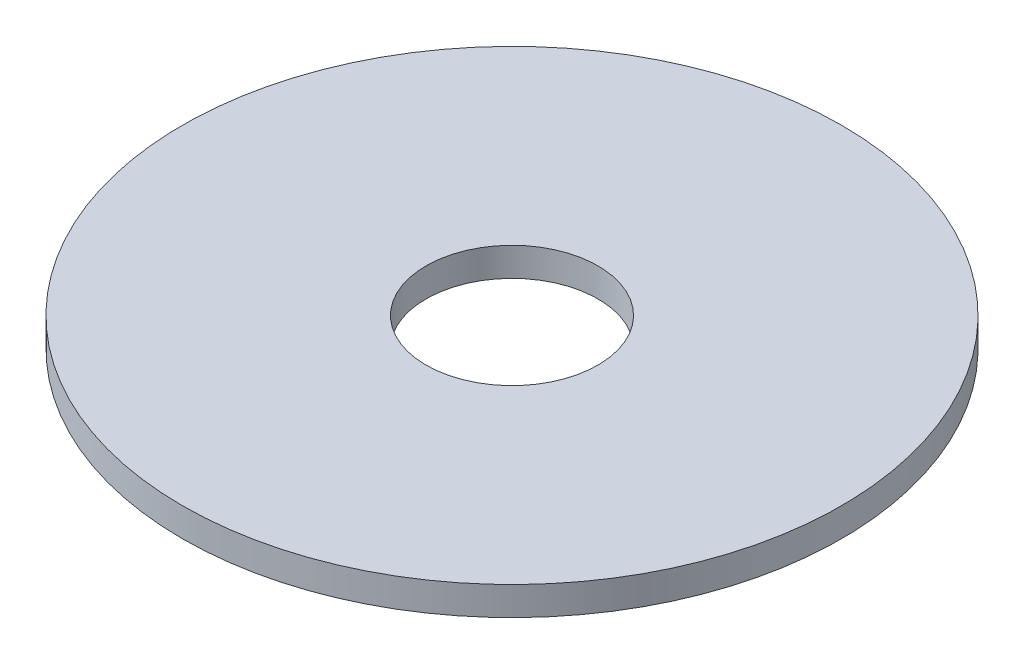
ISO-10303-21;
HEADER;
FILE_DESCRIPTION(('STEP AP214'),'2;1');
FILE_NAME('part.step','',(''),(''),'','','');
FILE_SCHEMA(('AUTOMOTIVE_DESIGN { 1 0 10303 214 1 1 1 1 }'));
ENDSEC;
DATA;
#1=APPLICATION_CONTEXT('core data for automotive mechanical design processes');
#2=APPLICATION_PROTOCOL_DEFINITION('international standard','automotive_design',2000,#1);
#3=PRODUCT_CONTEXT('',#1,'mechanical');
#4=PRODUCT('Part','Part','',(#3));
#5=PRODUCT_RELATED_PRODUCT_CATEGORY('part','',(#4));
#6=PRODUCT_DEFINITION_FORMATION('','',#4);
#7=PRODUCT_DEFINITION_CONTEXT('part definition',#1,'design');
#8=PRODUCT_DEFINITION('design','',#6,#7);
#9=PRODUCT_DEFINITION_SHAPE('','',#8);
#10=(LENGTH_UNIT() NAMED_UNIT(*) SI_UNIT(.MILLI.,.METRE.));
#11=(NAMED_UNIT(*) PLANE_ANGLE_UNIT() SI_UNIT($,.RADIAN.));
#12=(NAMED_UNIT(*) SI_UNIT($,.STERADIAN.) SOLID_ANGLE_UNIT());
#13=UNCERTAINTY_MEASURE_WITH_UNIT(LENGTH_MEASURE(1.E-05),#10,'distance_accuracy_value','');
#14=(GEOMETRIC_REPRESENTATION_CONTEXT(3) GLOBAL_UNCERTAINTY_ASSIGNED_CONTEXT((#13)) GLOBAL_UNIT_ASSIGNED_CONTEXT((#10,
#11,#12)) REPRESENTATION_CONTEXT('',''));
#15=CARTESIAN_POINT('',(0.,0.,0.));
#16=DIRECTION('',(0.,0.,1.));
#17=DIRECTION('',(1.,0.,0.));
#18=AXIS2_PLACEMENT_3D('',#15,#16,#17);
#19=CARTESIAN_POINT('',(0.,1.27,0.));
#20=DIRECTION('',(0.,1.,0.));
#21=DIRECTION('',(0.,0.,1.));
#22=AXIS2_PLACEMENT_3D('',#19,#20,#21);
#23=PLANE('',#22);
#24=CARTESIAN_POINT('',(0.,1.27,0.));
#25=DIRECTION('',(0.,1.,0.));
#26=DIRECTION('',(0.,0.,1.));
#27=AXIS2_PLACEMENT_3D('',#24,#25,#26);
#28=CIRCLE('',#27,14.605);
#29=CARTESIAN_POINT('',(0.,1.27,14.605));
#30=VERTEX_POINT('',#29);
#31=EDGE_CURVE('E10',#30,#30,#28,.T.);
#32=ORIENTED_EDGE('',*,*,#31,.T.);
#33=EDGE_LOOP('',(#32));
#34=FACE_BOUND('',#33,.T.);
#35=CARTESIAN_POINT('',(0.,1.27,0.));
#36=DIRECTION('',(0.,1.,0.));
#37=DIRECTION('',(0.,0.,1.));
#38=AXIS2_PLACEMENT_3D('',#35,#36,#37);
#39=CIRCLE('',#38,3.81);
#40=CARTESIAN_POINT('',(0.,1.27,3.81));
#41=VERTEX_POINT('',#40);
#42=EDGE_CURVE('E43',#41,#41,#39,.T.);
#43=ORIENTED_EDGE('',*,*,#42,.F.);
#44=EDGE_LOOP('',(#43));
#45=FACE_BOUND('',#44,.T.);
#46=ADVANCED_FACE('F32',(#34,#45),#23,.T.);
#47=CARTESIAN_POINT('',(0.,0.,0.));
#48=DIRECTION('',(0.,1.,0.));
#49=DIRECTION('',(0.,0.,1.));
#50=AXIS2_PLACEMENT_3D('',#47,#48,#49);
#51=PLANE('',#50);
#52=CARTESIAN_POINT('',(0.,0.,0.));
#53=DIRECTION('',(0.,1.,0.));
#54=DIRECTION('',(0.,0.,1.));
#55=AXIS2_PLACEMENT_3D('',#52,#53,#54);
#56=CIRCLE('',#55,14.605);
#57=CARTESIAN_POINT('',(0.,0.,14.605));
#58=VERTEX_POINT('',#57);
#59=EDGE_CURVE('E36',#58,#58,#56,.T.);
#60=ORIENTED_EDGE('',*,*,#59,.F.);
#61=EDGE_LOOP('',(#60));
#62=FACE_BOUND('',#61,.T.);
#63=CARTESIAN_POINT('',(0.,0.,0.));
#64=DIRECTION('',(0.,1.,0.));
#65=DIRECTION('',(0.,0.,1.));
#66=AXIS2_PLACEMENT_3D('',#63,#64,#65);
#67=CIRCLE('',#66,3.81);
#68=CARTESIAN_POINT('',(0.,0.,3.81));
#69=VERTEX_POINT('',#68);
#70=EDGE_CURVE('E45',#69,#69,#67,.T.);
#71=ORIENTED_EDGE('',*,*,#70,.T.);
#72=EDGE_LOOP('',(#71));
#73=FACE_BOUND('',#72,.T.);
#74=ADVANCED_FACE('F55',(#62,#73),#51,.F.);
#75=CARTESIAN_POINT('',(0.,1.27,0.));
#76=DIRECTION('',(0.,-1.,0.));
#77=DIRECTION('',(0.,0.,-1.));
#78=AXIS2_PLACEMENT_3D('',#75,#76,#77);
#79=CYLINDRICAL_SURFACE('',#78,14.605);
#80=ORIENTED_EDGE('',*,*,#31,.F.);
#81=EDGE_LOOP('',(#80));
#82=FACE_BOUND('',#81,.T.);
#83=ORIENTED_EDGE('',*,*,#59,.T.);
#84=EDGE_LOOP('',(#83));
#85=FACE_BOUND('',#84,.T.);
#86=ADVANCED_FACE('F34',(#82,#85),#79,.T.);
#87=CARTESIAN_POINT('',(0.,1.27,0.));
#88=DIRECTION('',(0.,-1.,0.));
#89=DIRECTION('',(0.,0.,-1.));
#90=AXIS2_PLACEMENT_3D('',#87,#88,#89);
#91=CYLINDRICAL_SURFACE('',#90,3.81);
#92=ORIENTED_EDGE('',*,*,#42,.T.);
#93=EDGE_LOOP('',(#92));
#94=FACE_BOUND('',#93,.T.);
#95=ORIENTED_EDGE('',*,*,#70,.F.);
#96=EDGE_LOOP('',(#95));
#97=FACE_BOUND('',#96,.T.);
#98=ADVANCED_FACE('F51',(#94,#97),#91,.F.);
#99=CLOSED_SHELL('',(#46,#74,#86,#98));
#100=MANIFOLD_SOLID_BREP('B2',#99);
#101=ADVANCED_BREP_SHAPE_REPRESENTATION('',(#18,#100),#14);
#102=SHAPE_DEFINITION_REPRESENTATION(#9,#101);
ENDSEC;
END-ISO-10303-21;
